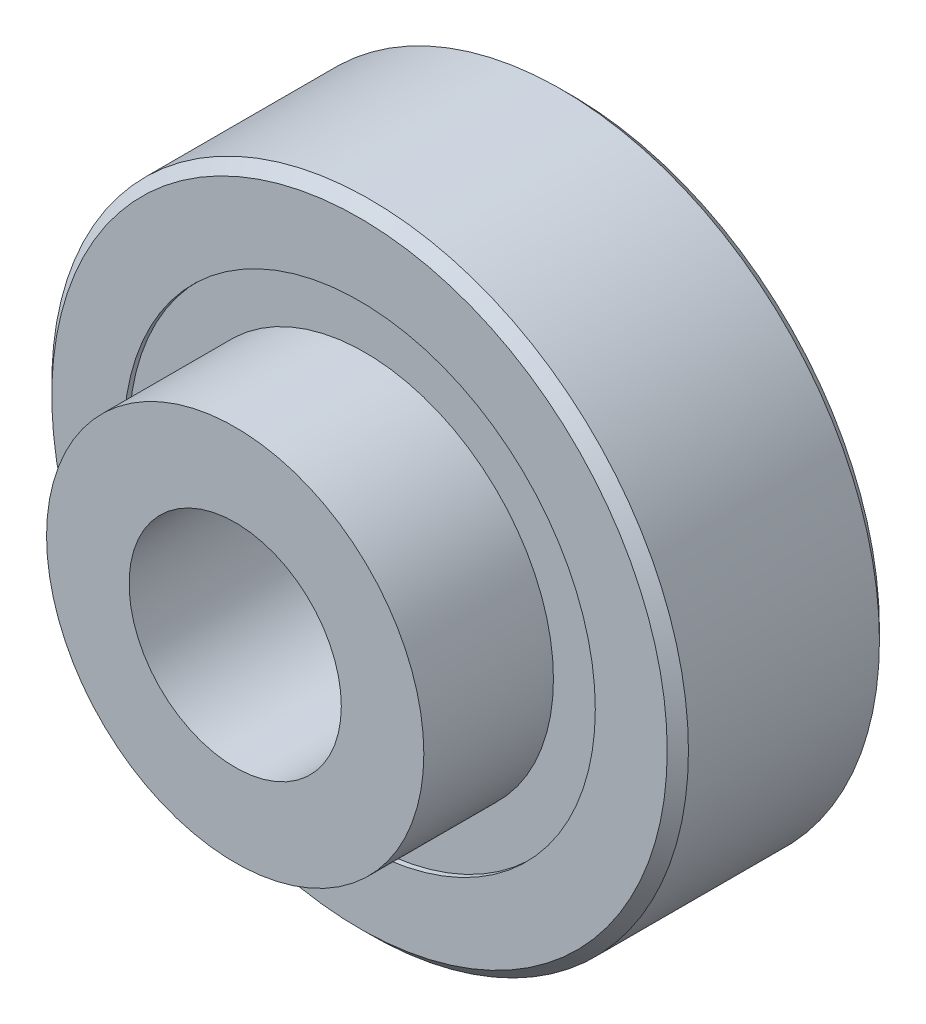
ISO-10303-21;
HEADER;
FILE_DESCRIPTION(('STEP AP214'),'2;1');
FILE_NAME('part.step','',(''),(''),'','','');
FILE_SCHEMA(('AUTOMOTIVE_DESIGN { 1 0 10303 214 1 1 1 1 }'));
ENDSEC;
DATA;
#1=APPLICATION_CONTEXT('core data for automotive mechanical design processes');
#2=APPLICATION_PROTOCOL_DEFINITION('international standard','automotive_design',2000,#1);
#3=PRODUCT_CONTEXT('',#1,'mechanical');
#4=PRODUCT('Part','Part','',(#3));
#5=PRODUCT_RELATED_PRODUCT_CATEGORY('part','',(#4));
#6=PRODUCT_DEFINITION_FORMATION('','',#4);
#7=PRODUCT_DEFINITION_CONTEXT('part definition',#1,'design');
#8=PRODUCT_DEFINITION('design','',#6,#7);
#9=PRODUCT_DEFINITION_SHAPE('','',#8);
#10=(LENGTH_UNIT() NAMED_UNIT(*) SI_UNIT(.MILLI.,.METRE.));
#11=(NAMED_UNIT(*) PLANE_ANGLE_UNIT() SI_UNIT($,.RADIAN.));
#12=(NAMED_UNIT(*) SI_UNIT($,.STERADIAN.) SOLID_ANGLE_UNIT());
#13=UNCERTAINTY_MEASURE_WITH_UNIT(LENGTH_MEASURE(1.E-05),#10,'distance_accuracy_value','');
#14=(GEOMETRIC_REPRESENTATION_CONTEXT(3) GLOBAL_UNCERTAINTY_ASSIGNED_CONTEXT((#13)) GLOBAL_UNIT_ASSIGNED_CONTEXT((#10,
#11,#12)) REPRESENTATION_CONTEXT('',''));
#15=CARTESIAN_POINT('',(0.,0.,0.));
#16=DIRECTION('',(0.,0.,1.));
#17=DIRECTION('',(1.,0.,0.));
#18=AXIS2_PLACEMENT_3D('',#15,#16,#17);
#19=CARTESIAN_POINT('',(0.,7.77777777777778,-1.73916398249984));
#20=DIRECTION('',(0.,0.,-1.));
#21=DIRECTION('',(-1.,0.,0.));
#22=AXIS2_PLACEMENT_3D('',#19,#20,#21);
#23=PLANE('',#22);
#24=CARTESIAN_POINT('',(0.,0.,-1.73916398249984));
#25=DIRECTION('',(0.,0.,1.));
#26=DIRECTION('',(1.,0.,0.));
#27=AXIS2_PLACEMENT_3D('',#24,#25,#26);
#28=CIRCLE('',#27,6.22222222222223);
#29=CARTESIAN_POINT('',(6.22222222222223,0.,-1.73916398249984));
#30=VERTEX_POINT('',#29);
#31=EDGE_CURVE('E11',#30,#30,#28,.T.);
#32=ORIENTED_EDGE('',*,*,#31,.F.);
#33=EDGE_LOOP('',(#32));
#34=FACE_BOUND('',#33,.T.);
#35=CARTESIAN_POINT('',(0.,0.,-1.73916398249984));
#36=DIRECTION('',(0.,0.,1.));
#37=DIRECTION('',(1.,0.,0.));
#38=AXIS2_PLACEMENT_3D('',#35,#36,#37);
#39=CIRCLE('',#38,7.77777777777778);
#40=CARTESIAN_POINT('',(7.77777777777778,0.,-1.73916398249984));
#41=VERTEX_POINT('',#40);
#42=EDGE_CURVE('E67',#41,#41,#39,.T.);
#43=ORIENTED_EDGE('',*,*,#42,.T.);
#44=EDGE_LOOP('',(#43));
#45=FACE_BOUND('',#44,.T.);
#46=ADVANCED_FACE('F48',(#34,#45),#23,.F.);
#47=CARTESIAN_POINT('',(0.,0.,3.5));
#48=DIRECTION('',(0.,0.,1.));
#49=DIRECTION('',(1.,0.,0.));
#50=AXIS2_PLACEMENT_3D('',#47,#48,#49);
#51=CYLINDRICAL_SURFACE('',#50,6.22222222222223);
#52=CARTESIAN_POINT('',(0.,0.,-3.325));
#53=DIRECTION('',(0.,0.,1.));
#54=DIRECTION('',(1.,0.,0.));
#55=AXIS2_PLACEMENT_3D('',#52,#53,#54);
#56=CIRCLE('',#55,6.22222222222223);
#57=CARTESIAN_POINT('',(6.22222222222223,0.,-3.325));
#58=VERTEX_POINT('',#57);
#59=EDGE_CURVE('E55',#58,#58,#56,.T.);
#60=ORIENTED_EDGE('',*,*,#59,.F.);
#61=EDGE_LOOP('',(#60));
#62=FACE_BOUND('',#61,.T.);
#63=ORIENTED_EDGE('',*,*,#31,.T.);
#64=EDGE_LOOP('',(#63));
#65=FACE_BOUND('',#64,.T.);
#66=ADVANCED_FACE('F84',(#62,#65),#51,.F.);
#67=CARTESIAN_POINT('',(0.,6.22222222222223,-3.325));
#68=DIRECTION('',(0.,0.,1.));
#69=DIRECTION('',(1.,0.,0.));
#70=AXIS2_PLACEMENT_3D('',#67,#68,#69);
#71=PLANE('',#70);
#72=CARTESIAN_POINT('',(0.,0.,-3.325));
#73=DIRECTION('',(0.,0.,1.));
#74=DIRECTION('',(1.,0.,0.));
#75=AXIS2_PLACEMENT_3D('',#72,#73,#74);
#76=CIRCLE('',#75,7.77777777777778);
#77=CARTESIAN_POINT('',(7.77777777777778,0.,-3.325));
#78=VERTEX_POINT('',#77);
#79=EDGE_CURVE('E61',#78,#78,#76,.T.);
#80=ORIENTED_EDGE('',*,*,#79,.F.);
#81=EDGE_LOOP('',(#80));
#82=FACE_BOUND('',#81,.T.);
#83=ORIENTED_EDGE('',*,*,#59,.T.);
#84=EDGE_LOOP('',(#83));
#85=FACE_BOUND('',#84,.T.);
#86=ADVANCED_FACE('F79',(#82,#85),#71,.F.);
#87=CARTESIAN_POINT('',(0.,0.,3.5));
#88=DIRECTION('',(0.,0.,1.));
#89=DIRECTION('',(1.,0.,0.));
#90=AXIS2_PLACEMENT_3D('',#87,#88,#89);
#91=CYLINDRICAL_SURFACE('',#90,7.77777777777778);
#92=ORIENTED_EDGE('',*,*,#42,.F.);
#93=EDGE_LOOP('',(#92));
#94=FACE_BOUND('',#93,.T.);
#95=ORIENTED_EDGE('',*,*,#79,.T.);
#96=EDGE_LOOP('',(#95));
#97=FACE_BOUND('',#96,.T.);
#98=ADVANCED_FACE('F76',(#94,#97),#91,.T.);
#99=CLOSED_SHELL('',(#46,#66,#86,#98));
#100=MANIFOLD_SOLID_BREP('B2',#99);
#101=CARTESIAN_POINT('',(0.,7.77777777777778,3.325));
#102=DIRECTION('',(0.,0.,-1.));
#103=DIRECTION('',(-1.,0.,0.));
#104=AXIS2_PLACEMENT_3D('',#101,#102,#103);
#105=PLANE('',#104);
#106=CARTESIAN_POINT('',(0.,0.,3.325));
#107=DIRECTION('',(0.,0.,1.));
#108=DIRECTION('',(1.,0.,0.));
#109=AXIS2_PLACEMENT_3D('',#106,#107,#108);
#110=CIRCLE('',#109,6.22222222222223);
#111=CARTESIAN_POINT('',(6.22222222222223,0.,3.325));
#112=VERTEX_POINT('',#111);
#113=EDGE_CURVE('E47',#112,#112,#110,.T.);
#114=ORIENTED_EDGE('',*,*,#113,.F.);
#115=EDGE_LOOP('',(#114));
#116=FACE_BOUND('',#115,.T.);
#117=CARTESIAN_POINT('',(0.,0.,3.325));
#118=DIRECTION('',(0.,0.,1.));
#119=DIRECTION('',(1.,0.,0.));
#120=AXIS2_PLACEMENT_3D('',#117,#118,#119);
#121=CIRCLE('',#120,7.77777777777778);
#122=CARTESIAN_POINT('',(7.77777777777778,0.,3.325));
#123=VERTEX_POINT('',#122);
#124=EDGE_CURVE('E153',#123,#123,#121,.T.);
#125=ORIENTED_EDGE('',*,*,#124,.T.);
#126=EDGE_LOOP('',(#125));
#127=FACE_BOUND('',#126,.T.);
#128=ADVANCED_FACE('F134',(#116,#127),#105,.F.);
#129=CARTESIAN_POINT('',(0.,0.,3.5));
#130=DIRECTION('',(0.,0.,1.));
#131=DIRECTION('',(1.,0.,0.));
#132=AXIS2_PLACEMENT_3D('',#129,#130,#131);
#133=CYLINDRICAL_SURFACE('',#132,6.22222222222223);
#134=CARTESIAN_POINT('',(0.,0.,1.73916398249984));
#135=DIRECTION('',(0.,0.,1.));
#136=DIRECTION('',(1.,0.,0.));
#137=AXIS2_PLACEMENT_3D('',#134,#135,#136);
#138=CIRCLE('',#137,6.22222222222223);
#139=CARTESIAN_POINT('',(6.22222222222223,0.,1.73916398249984));
#140=VERTEX_POINT('',#139);
#141=EDGE_CURVE('E141',#140,#140,#138,.T.);
#142=ORIENTED_EDGE('',*,*,#141,.F.);
#143=EDGE_LOOP('',(#142));
#144=FACE_BOUND('',#143,.T.);
#145=ORIENTED_EDGE('',*,*,#113,.T.);
#146=EDGE_LOOP('',(#145));
#147=FACE_BOUND('',#146,.T.);
#148=ADVANCED_FACE('F170',(#144,#147),#133,.F.);
#149=CARTESIAN_POINT('',(0.,7.77777777777778,1.73916398249984));
#150=DIRECTION('',(0.,0.,1.));
#151=DIRECTION('',(1.,0.,0.));
#152=AXIS2_PLACEMENT_3D('',#149,#150,#151);
#153=PLANE('',#152);
#154=CARTESIAN_POINT('',(0.,0.,1.73916398249984));
#155=DIRECTION('',(0.,0.,1.));
#156=DIRECTION('',(1.,0.,0.));
#157=AXIS2_PLACEMENT_3D('',#154,#155,#156);
#158=CIRCLE('',#157,7.77777777777778);
#159=CARTESIAN_POINT('',(7.77777777777778,0.,1.73916398249984));
#160=VERTEX_POINT('',#159);
#161=EDGE_CURVE('E147',#160,#160,#158,.T.);
#162=ORIENTED_EDGE('',*,*,#161,.F.);
#163=EDGE_LOOP('',(#162));
#164=FACE_BOUND('',#163,.T.);
#165=ORIENTED_EDGE('',*,*,#141,.T.);
#166=EDGE_LOOP('',(#165));
#167=FACE_BOUND('',#166,.T.);
#168=ADVANCED_FACE('F165',(#164,#167),#153,.F.);
#169=CARTESIAN_POINT('',(0.,0.,3.5));
#170=DIRECTION('',(0.,0.,1.));
#171=DIRECTION('',(1.,0.,0.));
#172=AXIS2_PLACEMENT_3D('',#169,#170,#171);
#173=CYLINDRICAL_SURFACE('',#172,7.77777777777778);
#174=ORIENTED_EDGE('',*,*,#124,.F.);
#175=EDGE_LOOP('',(#174));
#176=FACE_BOUND('',#175,.T.);
#177=ORIENTED_EDGE('',*,*,#161,.T.);
#178=EDGE_LOOP('',(#177));
#179=FACE_BOUND('',#178,.T.);
#180=ADVANCED_FACE('F162',(#176,#179),#173,.T.);
#181=CLOSED_SHELL('',(#128,#148,#168,#180));
#182=MANIFOLD_SOLID_BREP('B6',#181);
#183=CARTESIAN_POINT('',(0.,0.,3.5));
#184=DIRECTION('',(0.,0.,1.));
#185=DIRECTION('',(1.,0.,0.));
#186=AXIS2_PLACEMENT_3D('',#183,#184,#185);
#187=CYLINDRICAL_SURFACE('',#186,6.22222222222223);
#188=CARTESIAN_POINT('',(0.,0.,1.55555555555556));
#189=DIRECTION('',(0.,0.,1.));
#190=DIRECTION('',(1.,0.,0.));
#191=AXIS2_PLACEMENT_3D('',#188,#189,#190);
#192=CIRCLE('',#191,6.22222222222223);
#193=CARTESIAN_POINT('',(6.22222222222223,0.,1.55555555555556));
#194=VERTEX_POINT('',#193);
#195=EDGE_CURVE('E133',#194,#194,#192,.T.);
#196=ORIENTED_EDGE('',*,*,#195,.T.);
#197=EDGE_LOOP('',(#196));
#198=FACE_BOUND('',#197,.T.);
#199=CARTESIAN_POINT('',(0.,0.,7.6));
#200=DIRECTION('',(0.,0.,1.));
#201=DIRECTION('',(1.,0.,0.));
#202=AXIS2_PLACEMENT_3D('',#199,#200,#201);
#203=CIRCLE('',#202,6.22222222222222);
#204=CARTESIAN_POINT('',(6.22222222222222,0.,7.6));
#205=VERTEX_POINT('',#204);
#206=EDGE_CURVE('E248',#205,#205,#203,.T.);
#207=ORIENTED_EDGE('',*,*,#206,.F.);
#208=EDGE_LOOP('',(#207));
#209=FACE_BOUND('',#208,.T.);
#210=ADVANCED_FACE('F219',(#198,#209),#187,.T.);
#211=CARTESIAN_POINT('',(0.,0.,0.));
#212=DIRECTION('',(0.,0.,1.));
#213=DIRECTION('',(1.,0.,0.));
#214=AXIS2_PLACEMENT_3D('',#211,#212,#213);
#215=TOROIDAL_SURFACE('',#214,7.,1.73916398249983);
#216=ORIENTED_EDGE('',*,*,#195,.F.);
#217=EDGE_LOOP('',(#216));
#218=FACE_BOUND('',#217,.T.);
#219=CARTESIAN_POINT('',(0.,0.,-1.55555555555556));
#220=DIRECTION('',(0.,0.,1.));
#221=DIRECTION('',(1.,0.,0.));
#222=AXIS2_PLACEMENT_3D('',#219,#220,#221);
#223=CIRCLE('',#222,6.22222222222222);
#224=CARTESIAN_POINT('',(6.22222222222222,0.,-1.55555555555556));
#225=VERTEX_POINT('',#224);
#226=EDGE_CURVE('E226',#225,#225,#223,.T.);
#227=ORIENTED_EDGE('',*,*,#226,.T.);
#228=EDGE_LOOP('',(#227));
#229=FACE_BOUND('',#228,.T.);
#230=ADVANCED_FACE('F267',(#218,#229),#215,.F.);
#231=CARTESIAN_POINT('',(0.,0.,3.5));
#232=DIRECTION('',(0.,0.,1.));
#233=DIRECTION('',(1.,0.,0.));
#234=AXIS2_PLACEMENT_3D('',#231,#232,#233);
#235=CYLINDRICAL_SURFACE('',#234,6.22222222222223);
#236=ORIENTED_EDGE('',*,*,#226,.F.);
#237=EDGE_LOOP('',(#236));
#238=FACE_BOUND('',#237,.T.);
#239=CARTESIAN_POINT('',(0.,0.,-3.5));
#240=DIRECTION('',(0.,0.,1.));
#241=DIRECTION('',(1.,0.,0.));
#242=AXIS2_PLACEMENT_3D('',#239,#240,#241);
#243=CIRCLE('',#242,6.22222222222223);
#244=CARTESIAN_POINT('',(6.22222222222223,0.,-3.5));
#245=VERTEX_POINT('',#244);
#246=EDGE_CURVE('E232',#245,#245,#243,.T.);
#247=ORIENTED_EDGE('',*,*,#246,.T.);
#248=EDGE_LOOP('',(#247));
#249=FACE_BOUND('',#248,.T.);
#250=ADVANCED_FACE('F271',(#238,#249),#235,.T.);
#251=CARTESIAN_POINT('',(0.,3.85,-3.5));
#252=DIRECTION('',(0.,0.,1.));
#253=DIRECTION('',(1.,0.,0.));
#254=AXIS2_PLACEMENT_3D('',#251,#252,#253);
#255=PLANE('',#254);
#256=ORIENTED_EDGE('',*,*,#246,.F.);
#257=EDGE_LOOP('',(#256));
#258=FACE_BOUND('',#257,.T.);
#259=CARTESIAN_POINT('',(0.,0.,-3.5));
#260=DIRECTION('',(0.,0.,1.));
#261=DIRECTION('',(1.,0.,0.));
#262=AXIS2_PLACEMENT_3D('',#259,#260,#261);
#263=CIRCLE('',#262,3.85);
#264=CARTESIAN_POINT('',(3.85,0.,-3.5));
#265=VERTEX_POINT('',#264);
#266=EDGE_CURVE('E238',#265,#265,#263,.T.);
#267=ORIENTED_EDGE('',*,*,#266,.T.);
#268=EDGE_LOOP('',(#267));
#269=FACE_BOUND('',#268,.T.);
#270=ADVANCED_FACE('F276',(#258,#269),#255,.F.);
#271=CARTESIAN_POINT('',(0.,0.,-3.15));
#272=DIRECTION('',(0.,0.,-1.));
#273=DIRECTION('',(-1.,0.,0.));
#274=AXIS2_PLACEMENT_3D('',#271,#272,#273);
#275=CONICAL_SURFACE('',#274,3.5,0.785398163397446);
#276=ORIENTED_EDGE('',*,*,#266,.F.);
#277=EDGE_LOOP('',(#276));
#278=FACE_BOUND('',#277,.T.);
#279=CARTESIAN_POINT('',(0.,0.,-3.15));
#280=DIRECTION('',(0.,0.,1.));
#281=DIRECTION('',(1.,0.,0.));
#282=AXIS2_PLACEMENT_3D('',#279,#280,#281);
#283=CIRCLE('',#282,3.5);
#284=CARTESIAN_POINT('',(3.5,0.,-3.15));
#285=VERTEX_POINT('',#284);
#286=EDGE_CURVE('E244',#285,#285,#283,.T.);
#287=ORIENTED_EDGE('',*,*,#286,.T.);
#288=EDGE_LOOP('',(#287));
#289=FACE_BOUND('',#288,.T.);
#290=ADVANCED_FACE('F282',(#278,#289),#275,.F.);
#291=CARTESIAN_POINT('',(0.,0.,3.5));
#292=DIRECTION('',(0.,0.,1.));
#293=DIRECTION('',(1.,0.,0.));
#294=AXIS2_PLACEMENT_3D('',#291,#292,#293);
#295=CYLINDRICAL_SURFACE('',#294,3.5);
#296=ORIENTED_EDGE('',*,*,#286,.F.);
#297=EDGE_LOOP('',(#296));
#298=FACE_BOUND('',#297,.T.);
#299=CARTESIAN_POINT('',(0.,0.,7.6));
#300=DIRECTION('',(0.,0.,1.));
#301=DIRECTION('',(1.,0.,0.));
#302=AXIS2_PLACEMENT_3D('',#299,#300,#301);
#303=CIRCLE('',#302,3.5);
#304=CARTESIAN_POINT('',(3.5,0.,7.6));
#305=VERTEX_POINT('',#304);
#306=EDGE_CURVE('E252',#305,#305,#303,.T.);
#307=ORIENTED_EDGE('',*,*,#306,.T.);
#308=EDGE_LOOP('',(#307));
#309=FACE_BOUND('',#308,.T.);
#310=ADVANCED_FACE('F258',(#298,#309),#295,.F.);
#311=CARTESIAN_POINT('',(0.,6.22222222222222,7.6));
#312=DIRECTION('',(0.,0.,-1.));
#313=DIRECTION('',(-1.,0.,0.));
#314=AXIS2_PLACEMENT_3D('',#311,#312,#313);
#315=PLANE('',#314);
#316=ORIENTED_EDGE('',*,*,#306,.F.);
#317=EDGE_LOOP('',(#316));
#318=FACE_BOUND('',#317,.T.);
#319=ORIENTED_EDGE('',*,*,#206,.T.);
#320=EDGE_LOOP('',(#319));
#321=FACE_BOUND('',#320,.T.);
#322=ADVANCED_FACE('F260',(#318,#321),#315,.F.);
#323=CLOSED_SHELL('',(#210,#230,#250,#270,#290,#310,#322));
#324=MANIFOLD_SOLID_BREP('B42',#323);
#325=CARTESIAN_POINT('',(0.,0.,3.15));
#326=DIRECTION('',(0.,0.,-1.));
#327=DIRECTION('',(-1.,0.,0.));
#328=AXIS2_PLACEMENT_3D('',#325,#326,#327);
#329=CONICAL_SURFACE('',#328,10.5,0.785398163397445);
#330=CARTESIAN_POINT('',(0.,0.,3.5));
#331=DIRECTION('',(0.,0.,1.));
#332=DIRECTION('',(1.,0.,0.));
#333=AXIS2_PLACEMENT_3D('',#330,#331,#332);
#334=CIRCLE('',#333,10.15);
#335=CARTESIAN_POINT('',(10.15,0.,3.5));
#336=VERTEX_POINT('',#335);
#337=EDGE_CURVE('E397',#336,#336,#334,.T.);
#338=ORIENTED_EDGE('',*,*,#337,.F.);
#339=EDGE_LOOP('',(#338));
#340=FACE_BOUND('',#339,.T.);
#341=CARTESIAN_POINT('',(0.,0.,3.15));
#342=DIRECTION('',(0.,0.,1.));
#343=DIRECTION('',(1.,0.,0.));
#344=AXIS2_PLACEMENT_3D('',#341,#342,#343);
#345=CIRCLE('',#344,10.5);
#346=CARTESIAN_POINT('',(10.5,0.,3.15));
#347=VERTEX_POINT('',#346);
#348=EDGE_CURVE('E218',#347,#347,#345,.T.);
#349=ORIENTED_EDGE('',*,*,#348,.T.);
#350=EDGE_LOOP('',(#349));
#351=FACE_BOUND('',#350,.T.);
#352=ADVANCED_FACE('F360',(#340,#351),#329,.T.);
#353=CARTESIAN_POINT('',(0.,0.,3.5));
#354=DIRECTION('',(0.,0.,1.));
#355=DIRECTION('',(1.,0.,0.));
#356=AXIS2_PLACEMENT_3D('',#353,#354,#355);
#357=CYLINDRICAL_SURFACE('',#356,10.5);
#358=ORIENTED_EDGE('',*,*,#348,.F.);
#359=EDGE_LOOP('',(#358));
#360=FACE_BOUND('',#359,.T.);
#361=CARTESIAN_POINT('',(0.,0.,-3.15));
#362=DIRECTION('',(0.,0.,1.));
#363=DIRECTION('',(1.,0.,0.));
#364=AXIS2_PLACEMENT_3D('',#361,#362,#363);
#365=CIRCLE('',#364,10.5);
#366=CARTESIAN_POINT('',(10.5,0.,-3.15));
#367=VERTEX_POINT('',#366);
#368=EDGE_CURVE('E367',#367,#367,#365,.T.);
#369=ORIENTED_EDGE('',*,*,#368,.T.);
#370=EDGE_LOOP('',(#369));
#371=FACE_BOUND('',#370,.T.);
#372=ADVANCED_FACE('F406',(#360,#371),#357,.T.);
#373=CARTESIAN_POINT('',(0.,0.,-3.5));
#374=DIRECTION('',(0.,0.,1.));
#375=DIRECTION('',(1.,0.,0.));
#376=AXIS2_PLACEMENT_3D('',#373,#374,#375);
#377=CONICAL_SURFACE('',#376,10.15,0.785398163397446);
#378=ORIENTED_EDGE('',*,*,#368,.F.);
#379=EDGE_LOOP('',(#378));
#380=FACE_BOUND('',#379,.T.);
#381=CARTESIAN_POINT('',(0.,0.,-3.5));
#382=DIRECTION('',(0.,0.,1.));
#383=DIRECTION('',(1.,0.,0.));
#384=AXIS2_PLACEMENT_3D('',#381,#382,#383);
#385=CIRCLE('',#384,10.15);
#386=CARTESIAN_POINT('',(10.15,0.,-3.5));
#387=VERTEX_POINT('',#386);
#388=EDGE_CURVE('E373',#387,#387,#385,.T.);
#389=ORIENTED_EDGE('',*,*,#388,.T.);
#390=EDGE_LOOP('',(#389));
#391=FACE_BOUND('',#390,.T.);
#392=ADVANCED_FACE('F410',(#380,#391),#377,.T.);
#393=CARTESIAN_POINT('',(0.,10.15,-3.5));
#394=DIRECTION('',(0.,0.,1.));
#395=DIRECTION('',(1.,0.,0.));
#396=AXIS2_PLACEMENT_3D('',#393,#394,#395);
#397=PLANE('',#396);
#398=ORIENTED_EDGE('',*,*,#388,.F.);
#399=EDGE_LOOP('',(#398));
#400=FACE_BOUND('',#399,.T.);
#401=CARTESIAN_POINT('',(0.,0.,-3.5));
#402=DIRECTION('',(0.,0.,1.));
#403=DIRECTION('',(1.,0.,0.));
#404=AXIS2_PLACEMENT_3D('',#401,#402,#403);
#405=CIRCLE('',#404,7.77777777777778);
#406=CARTESIAN_POINT('',(7.77777777777778,0.,-3.5));
#407=VERTEX_POINT('',#406);
#408=EDGE_CURVE('E379',#407,#407,#405,.T.);
#409=ORIENTED_EDGE('',*,*,#408,.T.);
#410=EDGE_LOOP('',(#409));
#411=FACE_BOUND('',#410,.T.);
#412=ADVANCED_FACE('F415',(#400,#411),#397,.F.);
#413=CARTESIAN_POINT('',(0.,0.,3.5));
#414=DIRECTION('',(0.,0.,1.));
#415=DIRECTION('',(1.,0.,0.));
#416=AXIS2_PLACEMENT_3D('',#413,#414,#415);
#417=CYLINDRICAL_SURFACE('',#416,7.77777777777778);
#418=ORIENTED_EDGE('',*,*,#408,.F.);
#419=EDGE_LOOP('',(#418));
#420=FACE_BOUND('',#419,.T.);
#421=CARTESIAN_POINT('',(0.,0.,-1.55555555555556));
#422=DIRECTION('',(0.,0.,1.));
#423=DIRECTION('',(1.,0.,0.));
#424=AXIS2_PLACEMENT_3D('',#421,#422,#423);
#425=CIRCLE('',#424,7.77777777777778);
#426=CARTESIAN_POINT('',(7.77777777777778,0.,-1.55555555555556));
#427=VERTEX_POINT('',#426);
#428=EDGE_CURVE('E385',#427,#427,#425,.T.);
#429=ORIENTED_EDGE('',*,*,#428,.T.);
#430=EDGE_LOOP('',(#429));
#431=FACE_BOUND('',#430,.T.);
#432=ADVANCED_FACE('F421',(#420,#431),#417,.F.);
#433=CARTESIAN_POINT('',(0.,0.,0.));
#434=DIRECTION('',(0.,0.,1.));
#435=DIRECTION('',(1.,0.,0.));
#436=AXIS2_PLACEMENT_3D('',#433,#434,#435);
#437=TOROIDAL_SURFACE('',#436,7.,1.73916398249984);
#438=ORIENTED_EDGE('',*,*,#428,.F.);
#439=EDGE_LOOP('',(#438));
#440=FACE_BOUND('',#439,.T.);
#441=CARTESIAN_POINT('',(0.,0.,1.55555555555556));
#442=DIRECTION('',(0.,0.,1.));
#443=DIRECTION('',(1.,0.,0.));
#444=AXIS2_PLACEMENT_3D('',#441,#442,#443);
#445=CIRCLE('',#444,7.77777777777778);
#446=CARTESIAN_POINT('',(7.77777777777778,0.,1.55555555555556));
#447=VERTEX_POINT('',#446);
#448=EDGE_CURVE('E389',#447,#447,#445,.T.);
#449=ORIENTED_EDGE('',*,*,#448,.T.);
#450=EDGE_LOOP('',(#449));
#451=FACE_BOUND('',#450,.T.);
#452=ADVANCED_FACE('F425',(#440,#451),#437,.F.);
#453=CARTESIAN_POINT('',(0.,0.,3.5));
#454=DIRECTION('',(0.,0.,1.));
#455=DIRECTION('',(1.,0.,0.));
#456=AXIS2_PLACEMENT_3D('',#453,#454,#455);
#457=CYLINDRICAL_SURFACE('',#456,7.77777777777778);
#458=ORIENTED_EDGE('',*,*,#448,.F.);
#459=EDGE_LOOP('',(#458));
#460=FACE_BOUND('',#459,.T.);
#461=CARTESIAN_POINT('',(0.,0.,3.5));
#462=DIRECTION('',(0.,0.,1.));
#463=DIRECTION('',(1.,0.,0.));
#464=AXIS2_PLACEMENT_3D('',#461,#462,#463);
#465=CIRCLE('',#464,7.77777777777778);
#466=CARTESIAN_POINT('',(7.77777777777778,0.,3.5));
#467=VERTEX_POINT('',#466);
#468=EDGE_CURVE('E393',#467,#467,#465,.T.);
#469=ORIENTED_EDGE('',*,*,#468,.T.);
#470=EDGE_LOOP('',(#469));
#471=FACE_BOUND('',#470,.T.);
#472=ADVANCED_FACE('F429',(#460,#471),#457,.F.);
#473=CARTESIAN_POINT('',(0.,10.15,3.5));
#474=DIRECTION('',(0.,0.,-1.));
#475=DIRECTION('',(-1.,0.,0.));
#476=AXIS2_PLACEMENT_3D('',#473,#474,#475);
#477=PLANE('',#476);
#478=ORIENTED_EDGE('',*,*,#468,.F.);
#479=EDGE_LOOP('',(#478));
#480=FACE_BOUND('',#479,.T.);
#481=ORIENTED_EDGE('',*,*,#337,.T.);
#482=EDGE_LOOP('',(#481));
#483=FACE_BOUND('',#482,.T.);
#484=ADVANCED_FACE('F403',(#480,#483),#477,.F.);
#485=CLOSED_SHELL('',(#352,#372,#392,#412,#432,#452,#472,#484));
#486=MANIFOLD_SOLID_BREP('B128',#485);
#487=ADVANCED_BREP_SHAPE_REPRESENTATION('',(#18,#100,#182,#324,#486),#14);
#488=SHAPE_DEFINITION_REPRESENTATION(#9,#487);
ENDSEC;
END-ISO-10303-21;
